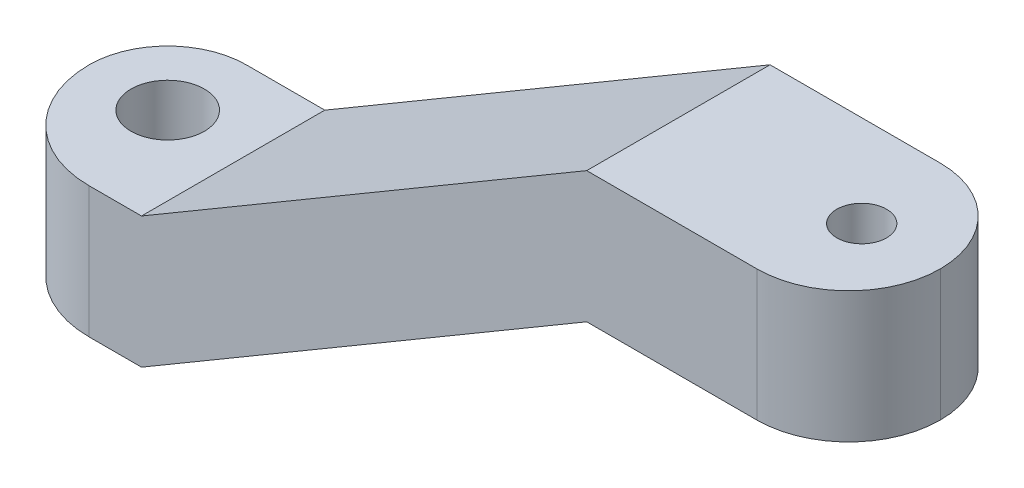
ISO-10303-21;
HEADER;
FILE_DESCRIPTION(('STEP AP214'),'2;1');
FILE_NAME('part.step','',(''),(''),'','','');
FILE_SCHEMA(('AUTOMOTIVE_DESIGN { 1 0 10303 214 1 1 1 1 }'));
ENDSEC;
DATA;
#1=APPLICATION_CONTEXT('core data for automotive mechanical design processes');
#2=APPLICATION_PROTOCOL_DEFINITION('international standard','automotive_design',2000,#1);
#3=PRODUCT_CONTEXT('',#1,'mechanical');
#4=PRODUCT('Part','Part','',(#3));
#5=PRODUCT_RELATED_PRODUCT_CATEGORY('part','',(#4));
#6=PRODUCT_DEFINITION_FORMATION('','',#4);
#7=PRODUCT_DEFINITION_CONTEXT('part definition',#1,'design');
#8=PRODUCT_DEFINITION('design','',#6,#7);
#9=PRODUCT_DEFINITION_SHAPE('','',#8);
#10=(LENGTH_UNIT() NAMED_UNIT(*) SI_UNIT(.MILLI.,.METRE.));
#11=(NAMED_UNIT(*) PLANE_ANGLE_UNIT() SI_UNIT($,.RADIAN.));
#12=(NAMED_UNIT(*) SI_UNIT($,.STERADIAN.) SOLID_ANGLE_UNIT());
#13=UNCERTAINTY_MEASURE_WITH_UNIT(LENGTH_MEASURE(1.E-05),#10,'distance_accuracy_value','');
#14=(GEOMETRIC_REPRESENTATION_CONTEXT(3) GLOBAL_UNCERTAINTY_ASSIGNED_CONTEXT((#13)) GLOBAL_UNIT_ASSIGNED_CONTEXT((#10,
#11,#12)) REPRESENTATION_CONTEXT('',''));
#15=CARTESIAN_POINT('',(0.,0.,0.));
#16=DIRECTION('',(0.,0.,1.));
#17=DIRECTION('',(1.,0.,0.));
#18=AXIS2_PLACEMENT_3D('',#15,#16,#17);
#19=CARTESIAN_POINT('',(0.,0.,7.));
#20=DIRECTION('',(-0.507020126563394,0.861934215157769,0.));
#21=DIRECTION('',(-0.861934215157769,-0.507020126563394,0.));
#22=AXIS2_PLACEMENT_3D('',#19,#20,#21);
#23=PLANE('',#22);
#24=DIRECTION('',(0.861934215157769,0.507020126563394,0.));
#25=VECTOR('',#24,1.);
#26=CARTESIAN_POINT('',(0.,0.,0.));
#27=LINE('',#26,#25);
#28=CARTESIAN_POINT('',(0.,0.,0.));
#29=VERTEX_POINT('',#28);
#30=CARTESIAN_POINT('',(17.,10.,0.));
#31=VERTEX_POINT('',#30);
#32=EDGE_CURVE('E138',#29,#31,#27,.T.);
#33=ORIENTED_EDGE('',*,*,#32,.T.);
#34=DIRECTION('',(0.,0.,-1.));
#35=VECTOR('',#34,1.);
#36=CARTESIAN_POINT('',(17.,10.,7.));
#37=LINE('',#36,#35);
#38=CARTESIAN_POINT('',(17.,10.,7.));
#39=VERTEX_POINT('',#38);
#40=EDGE_CURVE('E116',#39,#31,#37,.T.);
#41=ORIENTED_EDGE('',*,*,#40,.F.);
#42=DIRECTION('',(0.861934215157769,0.507020126563394,0.));
#43=VECTOR('',#42,1.);
#44=CARTESIAN_POINT('',(0.,0.,7.));
#45=LINE('',#44,#43);
#46=CARTESIAN_POINT('',(0.,0.,7.));
#47=VERTEX_POINT('',#46);
#48=EDGE_CURVE('E124',#47,#39,#45,.T.);
#49=ORIENTED_EDGE('',*,*,#48,.F.);
#50=DIRECTION('',(0.,0.,-1.));
#51=VECTOR('',#50,1.);
#52=CARTESIAN_POINT('',(0.,0.,7.));
#53=LINE('',#52,#51);
#54=EDGE_CURVE('E190',#47,#29,#53,.T.);
#55=ORIENTED_EDGE('',*,*,#54,.T.);
#56=EDGE_LOOP('',(#33,#41,#49,#55));
#57=FACE_BOUND('',#56,.T.);
#58=ADVANCED_FACE('F35',(#57),#23,.F.);
#59=CARTESIAN_POINT('',(17.,10.,7.));
#60=DIRECTION('',(0.,1.,0.));
#61=DIRECTION('',(0.,0.,1.));
#62=AXIS2_PLACEMENT_3D('',#59,#60,#61);
#63=PLANE('',#62);
#64=CARTESIAN_POINT('',(24.,10.,3.5));
#65=DIRECTION('',(0.,1.,0.));
#66=DIRECTION('',(0.,0.,1.));
#67=AXIS2_PLACEMENT_3D('',#64,#65,#66);
#68=CIRCLE('',#67,0.950000000000001);
#69=CARTESIAN_POINT('',(24.,10.,4.45));
#70=VERTEX_POINT('',#69);
#71=EDGE_CURVE('E225',#70,#70,#68,.T.);
#72=ORIENTED_EDGE('',*,*,#71,.T.);
#73=EDGE_LOOP('',(#72));
#74=FACE_BOUND('',#73,.T.);
#75=CARTESIAN_POINT('',(23.5,10.,3.5));
#76=DIRECTION('',(0.,1.,0.));
#77=DIRECTION('',(0.,0.,1.));
#78=AXIS2_PLACEMENT_3D('',#75,#76,#77);
#79=CIRCLE('',#78,3.5);
#80=CARTESIAN_POINT('',(23.5,10.,0.));
#81=VERTEX_POINT('',#80);
#82=CARTESIAN_POINT('',(27.,10.,3.5));
#83=VERTEX_POINT('',#82);
#84=EDGE_CURVE('E156',#81,#83,#79,.F.);
#85=ORIENTED_EDGE('',*,*,#84,.T.);
#86=CARTESIAN_POINT('',(23.5,10.,3.5));
#87=DIRECTION('',(0.,1.,0.));
#88=DIRECTION('',(0.,0.,1.));
#89=AXIS2_PLACEMENT_3D('',#86,#87,#88);
#90=CIRCLE('',#89,3.5);
#91=CARTESIAN_POINT('',(23.5,10.,7.));
#92=VERTEX_POINT('',#91);
#93=EDGE_CURVE('E119',#83,#92,#90,.F.);
#94=ORIENTED_EDGE('',*,*,#93,.T.);
#95=DIRECTION('',(1.,0.,0.));
#96=VECTOR('',#95,1.);
#97=CARTESIAN_POINT('',(17.,10.,7.));
#98=LINE('',#97,#96);
#99=EDGE_CURVE('E111',#39,#92,#98,.T.);
#100=ORIENTED_EDGE('',*,*,#99,.F.);
#101=ORIENTED_EDGE('',*,*,#40,.T.);
#102=DIRECTION('',(1.,0.,0.));
#103=VECTOR('',#102,1.);
#104=CARTESIAN_POINT('',(17.,10.,0.));
#105=LINE('',#104,#103);
#106=EDGE_CURVE('E196',#31,#81,#105,.T.);
#107=ORIENTED_EDGE('',*,*,#106,.T.);
#108=EDGE_LOOP('',(#85,#94,#100,#101,#107));
#109=FACE_BOUND('',#108,.T.);
#110=ADVANCED_FACE('F113',(#74,#109),#63,.F.);
#111=CARTESIAN_POINT('',(17.,15.,7.));
#112=DIRECTION('',(0.,-1.,0.));
#113=DIRECTION('',(0.,0.,-1.));
#114=AXIS2_PLACEMENT_3D('',#111,#112,#113);
#115=PLANE('',#114);
#116=CARTESIAN_POINT('',(24.,15.,3.5));
#117=DIRECTION('',(0.,1.,0.));
#118=DIRECTION('',(-1.,0.,0.));
#119=AXIS2_PLACEMENT_3D('',#116,#117,#118);
#120=CIRCLE('',#119,0.950000000000001);
#121=CARTESIAN_POINT('',(23.05,15.,3.5));
#122=VERTEX_POINT('',#121);
#123=EDGE_CURVE('E165',#122,#122,#120,.T.);
#124=ORIENTED_EDGE('',*,*,#123,.F.);
#125=EDGE_LOOP('',(#124));
#126=FACE_BOUND('',#125,.T.);
#127=DIRECTION('',(-1.,0.,0.));
#128=VECTOR('',#127,1.);
#129=CARTESIAN_POINT('',(17.,15.,7.));
#130=LINE('',#129,#128);
#131=CARTESIAN_POINT('',(23.5,15.,7.));
#132=VERTEX_POINT('',#131);
#133=CARTESIAN_POINT('',(17.,15.,7.));
#134=VERTEX_POINT('',#133);
#135=EDGE_CURVE('E123',#132,#134,#130,.T.);
#136=ORIENTED_EDGE('',*,*,#135,.F.);
#137=CARTESIAN_POINT('',(23.5,15.,3.5));
#138=DIRECTION('',(0.,-1.,0.));
#139=DIRECTION('',(0.,0.,-1.));
#140=AXIS2_PLACEMENT_3D('',#137,#138,#139);
#141=CIRCLE('',#140,3.5);
#142=CARTESIAN_POINT('',(27.,15.,3.5));
#143=VERTEX_POINT('',#142);
#144=EDGE_CURVE('E154',#132,#143,#141,.F.);
#145=ORIENTED_EDGE('',*,*,#144,.T.);
#146=CARTESIAN_POINT('',(23.5,15.,3.5));
#147=DIRECTION('',(0.,-1.,0.));
#148=DIRECTION('',(0.,0.,-1.));
#149=AXIS2_PLACEMENT_3D('',#146,#147,#148);
#150=CIRCLE('',#149,3.5);
#151=CARTESIAN_POINT('',(23.5,15.,0.));
#152=VERTEX_POINT('',#151);
#153=EDGE_CURVE('E142',#143,#152,#150,.F.);
#154=ORIENTED_EDGE('',*,*,#153,.T.);
#155=DIRECTION('',(-1.,0.,0.));
#156=VECTOR('',#155,1.);
#157=CARTESIAN_POINT('',(17.,15.,0.));
#158=LINE('',#157,#156);
#159=CARTESIAN_POINT('',(17.,15.,0.));
#160=VERTEX_POINT('',#159);
#161=EDGE_CURVE('E198',#152,#160,#158,.T.);
#162=ORIENTED_EDGE('',*,*,#161,.T.);
#163=DIRECTION('',(0.,0.,-1.));
#164=VECTOR('',#163,1.);
#165=CARTESIAN_POINT('',(17.,15.,7.));
#166=LINE('',#165,#164);
#167=EDGE_CURVE('E140',#134,#160,#166,.T.);
#168=ORIENTED_EDGE('',*,*,#167,.F.);
#169=EDGE_LOOP('',(#136,#145,#154,#162,#168));
#170=FACE_BOUND('',#169,.T.);
#171=ADVANCED_FACE('F213',(#126,#170),#115,.F.);
#172=CARTESIAN_POINT('',(17.,15.,7.));
#173=DIRECTION('',(0.507020126563394,-0.861934215157769,0.));
#174=DIRECTION('',(0.861934215157769,0.507020126563394,0.));
#175=AXIS2_PLACEMENT_3D('',#172,#173,#174);
#176=PLANE('',#175);
#177=DIRECTION('',(-0.861934215157769,-0.507020126563394,0.));
#178=VECTOR('',#177,1.);
#179=CARTESIAN_POINT('',(17.,15.,0.));
#180=LINE('',#179,#178);
#181=CARTESIAN_POINT('',(0.,5.,0.));
#182=VERTEX_POINT('',#181);
#183=EDGE_CURVE('E200',#160,#182,#180,.T.);
#184=ORIENTED_EDGE('',*,*,#183,.T.);
#185=DIRECTION('',(0.,0.,-1.));
#186=VECTOR('',#185,1.);
#187=CARTESIAN_POINT('',(0.,5.,7.));
#188=LINE('',#187,#186);
#189=CARTESIAN_POINT('',(0.,5.,7.));
#190=VERTEX_POINT('',#189);
#191=EDGE_CURVE('E145',#190,#182,#188,.T.);
#192=ORIENTED_EDGE('',*,*,#191,.F.);
#193=DIRECTION('',(-0.861934215157769,-0.507020126563394,0.));
#194=VECTOR('',#193,1.);
#195=CARTESIAN_POINT('',(17.,15.,7.));
#196=LINE('',#195,#194);
#197=EDGE_CURVE('E185',#134,#190,#196,.T.);
#198=ORIENTED_EDGE('',*,*,#197,.F.);
#199=ORIENTED_EDGE('',*,*,#167,.T.);
#200=EDGE_LOOP('',(#184,#192,#198,#199));
#201=FACE_BOUND('',#200,.T.);
#202=ADVANCED_FACE('F209',(#201),#176,.F.);
#203=CARTESIAN_POINT('',(0.,5.,7.));
#204=DIRECTION('',(0.,-1.,0.));
#205=DIRECTION('',(0.,0.,-1.));
#206=AXIS2_PLACEMENT_3D('',#203,#204,#205);
#207=PLANE('',#206);
#208=CARTESIAN_POINT('',(-3.,5.,3.));
#209=DIRECTION('',(0.,1.,0.));
#210=DIRECTION('',(0.,0.,1.));
#211=AXIS2_PLACEMENT_3D('',#208,#209,#210);
#212=CIRCLE('',#211,1.4);
#213=CARTESIAN_POINT('',(-3.,5.,4.4));
#214=VERTEX_POINT('',#213);
#215=EDGE_CURVE('E151',#214,#214,#212,.T.);
#216=ORIENTED_EDGE('',*,*,#215,.F.);
#217=EDGE_LOOP('',(#216));
#218=FACE_BOUND('',#217,.T.);
#219=DIRECTION('',(-1.,0.,0.));
#220=VECTOR('',#219,1.);
#221=CARTESIAN_POINT('',(0.,5.,0.));
#222=LINE('',#221,#220);
#223=CARTESIAN_POINT('',(-3.,5.,0.));
#224=VERTEX_POINT('',#223);
#225=EDGE_CURVE('E202',#182,#224,#222,.T.);
#226=ORIENTED_EDGE('',*,*,#225,.T.);
#227=CARTESIAN_POINT('',(-3.,5.,3.));
#228=DIRECTION('',(0.,-1.,0.));
#229=DIRECTION('',(0.,0.,-1.));
#230=AXIS2_PLACEMENT_3D('',#227,#228,#229);
#231=CIRCLE('',#230,3.);
#232=CARTESIAN_POINT('',(-6.,5.,3.));
#233=VERTEX_POINT('',#232);
#234=EDGE_CURVE('E11',#224,#233,#231,.F.);
#235=ORIENTED_EDGE('',*,*,#234,.T.);
#236=CARTESIAN_POINT('',(-2.,5.,3.));
#237=DIRECTION('',(0.,-1.,0.));
#238=DIRECTION('',(0.,0.,-1.));
#239=AXIS2_PLACEMENT_3D('',#236,#237,#238);
#240=CIRCLE('',#239,4.);
#241=CARTESIAN_POINT('',(-2.,5.,7.));
#242=VERTEX_POINT('',#241);
#243=EDGE_CURVE('E172',#233,#242,#240,.F.);
#244=ORIENTED_EDGE('',*,*,#243,.T.);
#245=DIRECTION('',(-1.,0.,0.));
#246=VECTOR('',#245,1.);
#247=CARTESIAN_POINT('',(0.,5.,7.));
#248=LINE('',#247,#246);
#249=EDGE_CURVE('E179',#190,#242,#248,.T.);
#250=ORIENTED_EDGE('',*,*,#249,.F.);
#251=ORIENTED_EDGE('',*,*,#191,.T.);
#252=EDGE_LOOP('',(#226,#235,#244,#250,#251));
#253=FACE_BOUND('',#252,.T.);
#254=ADVANCED_FACE('F177',(#218,#253),#207,.F.);
#255=CARTESIAN_POINT('',(0.,0.,7.));
#256=DIRECTION('',(0.,1.,0.));
#257=DIRECTION('',(0.,0.,1.));
#258=AXIS2_PLACEMENT_3D('',#255,#256,#257);
#259=PLANE('',#258);
#260=CARTESIAN_POINT('',(-3.,0.,3.));
#261=DIRECTION('',(0.,1.,0.));
#262=DIRECTION('',(0.,0.,1.));
#263=AXIS2_PLACEMENT_3D('',#260,#261,#262);
#264=CIRCLE('',#263,1.4);
#265=CARTESIAN_POINT('',(-3.,0.,4.4));
#266=VERTEX_POINT('',#265);
#267=EDGE_CURVE('E149',#266,#266,#264,.T.);
#268=ORIENTED_EDGE('',*,*,#267,.T.);
#269=EDGE_LOOP('',(#268));
#270=FACE_BOUND('',#269,.T.);
#271=CARTESIAN_POINT('',(-2.,0.,3.));
#272=DIRECTION('',(0.,1.,0.));
#273=DIRECTION('',(0.,0.,1.));
#274=AXIS2_PLACEMENT_3D('',#271,#272,#273);
#275=CIRCLE('',#274,4.);
#276=CARTESIAN_POINT('',(-2.,0.,7.));
#277=VERTEX_POINT('',#276);
#278=CARTESIAN_POINT('',(-6.,0.,3.));
#279=VERTEX_POINT('',#278);
#280=EDGE_CURVE('E167',#277,#279,#275,.F.);
#281=ORIENTED_EDGE('',*,*,#280,.T.);
#282=CARTESIAN_POINT('',(-3.,0.,3.));
#283=DIRECTION('',(0.,1.,0.));
#284=DIRECTION('',(0.,0.,1.));
#285=AXIS2_PLACEMENT_3D('',#282,#283,#284);
#286=CIRCLE('',#285,3.);
#287=CARTESIAN_POINT('',(-3.,0.,0.));
#288=VERTEX_POINT('',#287);
#289=EDGE_CURVE('E57',#279,#288,#286,.F.);
#290=ORIENTED_EDGE('',*,*,#289,.T.);
#291=DIRECTION('',(1.,0.,0.));
#292=VECTOR('',#291,1.);
#293=CARTESIAN_POINT('',(0.,0.,0.));
#294=LINE('',#293,#292);
#295=EDGE_CURVE('E135',#288,#29,#294,.T.);
#296=ORIENTED_EDGE('',*,*,#295,.T.);
#297=ORIENTED_EDGE('',*,*,#54,.F.);
#298=DIRECTION('',(1.,0.,0.));
#299=VECTOR('',#298,1.);
#300=CARTESIAN_POINT('',(0.,0.,7.));
#301=LINE('',#300,#299);
#302=EDGE_CURVE('E131',#277,#47,#301,.T.);
#303=ORIENTED_EDGE('',*,*,#302,.F.);
#304=EDGE_LOOP('',(#281,#290,#296,#297,#303));
#305=FACE_BOUND('',#304,.T.);
#306=ADVANCED_FACE('F189',(#270,#305),#259,.F.);
#307=CARTESIAN_POINT('',(0.,0.,7.));
#308=DIRECTION('',(0.,0.,-1.));
#309=DIRECTION('',(-1.,0.,0.));
#310=AXIS2_PLACEMENT_3D('',#307,#308,#309);
#311=PLANE('',#310);
#312=ORIENTED_EDGE('',*,*,#249,.T.);
#313=DIRECTION('',(0.,-1.,0.));
#314=VECTOR('',#313,1.);
#315=CARTESIAN_POINT('',(-2.,0.,7.));
#316=LINE('',#315,#314);
#317=EDGE_CURVE('E161',#242,#277,#316,.T.);
#318=ORIENTED_EDGE('',*,*,#317,.T.);
#319=ORIENTED_EDGE('',*,*,#302,.T.);
#320=ORIENTED_EDGE('',*,*,#48,.T.);
#321=ORIENTED_EDGE('',*,*,#99,.T.);
#322=DIRECTION('',(0.,1.,0.));
#323=VECTOR('',#322,1.);
#324=CARTESIAN_POINT('',(23.5,0.,7.));
#325=LINE('',#324,#323);
#326=EDGE_CURVE('E139',#92,#132,#325,.T.);
#327=ORIENTED_EDGE('',*,*,#326,.T.);
#328=ORIENTED_EDGE('',*,*,#135,.T.);
#329=ORIENTED_EDGE('',*,*,#197,.T.);
#330=EDGE_LOOP('',(#312,#318,#319,#320,#321,#327,#328,#329));
#331=FACE_BOUND('',#330,.T.);
#332=ADVANCED_FACE('F128',(#331),#311,.F.);
#333=CARTESIAN_POINT('',(0.,0.,0.));
#334=DIRECTION('',(0.,0.,-1.));
#335=DIRECTION('',(-1.,0.,0.));
#336=AXIS2_PLACEMENT_3D('',#333,#334,#335);
#337=PLANE('',#336);
#338=ORIENTED_EDGE('',*,*,#295,.F.);
#339=DIRECTION('',(0.,-1.,0.));
#340=VECTOR('',#339,1.);
#341=CARTESIAN_POINT('',(-3.,5.,0.));
#342=LINE('',#341,#340);
#343=EDGE_CURVE('E43',#288,#224,#342,.F.);
#344=ORIENTED_EDGE('',*,*,#343,.T.);
#345=ORIENTED_EDGE('',*,*,#225,.F.);
#346=ORIENTED_EDGE('',*,*,#183,.F.);
#347=ORIENTED_EDGE('',*,*,#161,.F.);
#348=DIRECTION('',(0.,1.,0.));
#349=VECTOR('',#348,1.);
#350=CARTESIAN_POINT('',(23.5,10.,0.));
#351=LINE('',#350,#349);
#352=EDGE_CURVE('E159',#152,#81,#351,.F.);
#353=ORIENTED_EDGE('',*,*,#352,.T.);
#354=ORIENTED_EDGE('',*,*,#106,.F.);
#355=ORIENTED_EDGE('',*,*,#32,.F.);
#356=EDGE_LOOP('',(#338,#344,#345,#346,#347,#353,#354,#355));
#357=FACE_BOUND('',#356,.T.);
#358=ADVANCED_FACE('F206',(#357),#337,.T.);
#359=CARTESIAN_POINT('',(-3.,-2.,3.));
#360=DIRECTION('',(0.,1.,0.));
#361=DIRECTION('',(0.,0.,1.));
#362=AXIS2_PLACEMENT_3D('',#359,#360,#361);
#363=CYLINDRICAL_SURFACE('',#362,1.4);
#364=ORIENTED_EDGE('',*,*,#215,.T.);
#365=EDGE_LOOP('',(#364));
#366=FACE_BOUND('',#365,.T.);
#367=ORIENTED_EDGE('',*,*,#267,.F.);
#368=EDGE_LOOP('',(#367));
#369=FACE_BOUND('',#368,.T.);
#370=ADVANCED_FACE('F273',(#366,#369),#363,.F.);
#371=CARTESIAN_POINT('',(24.,8.,3.5));
#372=DIRECTION('',(0.,1.,0.));
#373=DIRECTION('',(-1.,0.,0.));
#374=AXIS2_PLACEMENT_3D('',#371,#372,#373);
#375=CYLINDRICAL_SURFACE('',#374,0.950000000000001);
#376=ORIENTED_EDGE('',*,*,#123,.T.);
#377=EDGE_LOOP('',(#376));
#378=FACE_BOUND('',#377,.T.);
#379=ORIENTED_EDGE('',*,*,#71,.F.);
#380=EDGE_LOOP('',(#379));
#381=FACE_BOUND('',#380,.T.);
#382=ADVANCED_FACE('F231',(#378,#381),#375,.F.);
#383=CARTESIAN_POINT('',(23.5,15.,3.5));
#384=DIRECTION('',(0.,-1.,0.));
#385=DIRECTION('',(1.,0.,0.));
#386=AXIS2_PLACEMENT_3D('',#383,#384,#385);
#387=CYLINDRICAL_SURFACE('',#386,3.5);
#388=DIRECTION('',(0.,1.,0.));
#389=VECTOR('',#388,1.);
#390=CARTESIAN_POINT('',(27.,15.,3.5));
#391=LINE('',#390,#389);
#392=EDGE_CURVE('E162',#83,#143,#391,.T.);
#393=ORIENTED_EDGE('',*,*,#392,.F.);
#394=ORIENTED_EDGE('',*,*,#84,.F.);
#395=ORIENTED_EDGE('',*,*,#352,.F.);
#396=ORIENTED_EDGE('',*,*,#153,.F.);
#397=EDGE_LOOP('',(#393,#394,#395,#396));
#398=FACE_BOUND('',#397,.T.);
#399=ADVANCED_FACE('F217',(#398),#387,.T.);
#400=CARTESIAN_POINT('',(23.5,0.,3.5));
#401=DIRECTION('',(0.,1.,0.));
#402=DIRECTION('',(-1.,0.,0.));
#403=AXIS2_PLACEMENT_3D('',#400,#401,#402);
#404=CYLINDRICAL_SURFACE('',#403,3.5);
#405=ORIENTED_EDGE('',*,*,#93,.F.);
#406=ORIENTED_EDGE('',*,*,#392,.T.);
#407=ORIENTED_EDGE('',*,*,#144,.F.);
#408=ORIENTED_EDGE('',*,*,#326,.F.);
#409=EDGE_LOOP('',(#405,#406,#407,#408));
#410=FACE_BOUND('',#409,.T.);
#411=ADVANCED_FACE('F220',(#410),#404,.T.);
#412=CARTESIAN_POINT('',(-2.,0.,3.));
#413=DIRECTION('',(0.,-1.,0.));
#414=DIRECTION('',(0.,0.,-1.));
#415=AXIS2_PLACEMENT_3D('',#412,#413,#414);
#416=CYLINDRICAL_SURFACE('',#415,4.);
#417=ORIENTED_EDGE('',*,*,#243,.F.);
#418=DIRECTION('',(0.,-1.,0.));
#419=VECTOR('',#418,1.);
#420=CARTESIAN_POINT('',(-6.,0.,3.));
#421=LINE('',#420,#419);
#422=EDGE_CURVE('E169',#279,#233,#421,.F.);
#423=ORIENTED_EDGE('',*,*,#422,.F.);
#424=ORIENTED_EDGE('',*,*,#280,.F.);
#425=ORIENTED_EDGE('',*,*,#317,.F.);
#426=EDGE_LOOP('',(#417,#423,#424,#425));
#427=FACE_BOUND('',#426,.T.);
#428=ADVANCED_FACE('F188',(#427),#416,.T.);
#429=CARTESIAN_POINT('',(-3.,0.,3.));
#430=DIRECTION('',(0.,1.,0.));
#431=DIRECTION('',(0.,0.,1.));
#432=AXIS2_PLACEMENT_3D('',#429,#430,#431);
#433=CYLINDRICAL_SURFACE('',#432,3.);
#434=ORIENTED_EDGE('',*,*,#234,.F.);
#435=ORIENTED_EDGE('',*,*,#343,.F.);
#436=ORIENTED_EDGE('',*,*,#289,.F.);
#437=ORIENTED_EDGE('',*,*,#422,.T.);
#438=EDGE_LOOP('',(#434,#435,#436,#437));
#439=FACE_BOUND('',#438,.T.);
#440=ADVANCED_FACE('F37',(#439),#433,.T.);
#441=CLOSED_SHELL('',(#58,#110,#171,#202,#254,#306,#332,#358,#370,#382,#399,#411,#428,#440));
#442=MANIFOLD_SOLID_BREP('B2',#441);
#443=ADVANCED_BREP_SHAPE_REPRESENTATION('',(#18,#442),#14);
#444=SHAPE_DEFINITION_REPRESENTATION(#9,#443);
ENDSEC;
END-ISO-10303-21;
